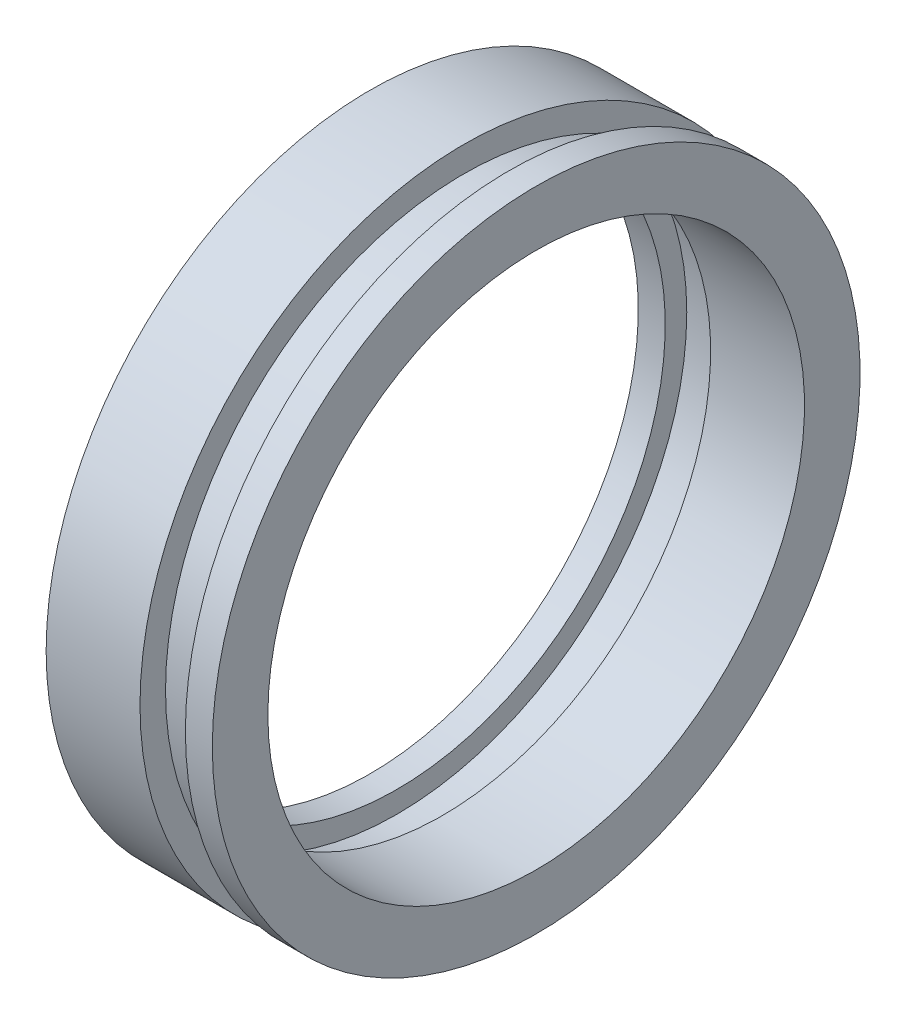
ISO-10303-21;
HEADER;
FILE_DESCRIPTION(('STEP AP214'),'2;1');
FILE_NAME('part.step','',(''),(''),'','','');
FILE_SCHEMA(('AUTOMOTIVE_DESIGN { 1 0 10303 214 1 1 1 1 }'));
ENDSEC;
DATA;
#1=APPLICATION_CONTEXT('core data for automotive mechanical design processes');
#2=APPLICATION_PROTOCOL_DEFINITION('international standard','automotive_design',2000,#1);
#3=PRODUCT_CONTEXT('',#1,'mechanical');
#4=PRODUCT('Part','Part','',(#3));
#5=PRODUCT_RELATED_PRODUCT_CATEGORY('part','',(#4));
#6=PRODUCT_DEFINITION_FORMATION('','',#4);
#7=PRODUCT_DEFINITION_CONTEXT('part definition',#1,'design');
#8=PRODUCT_DEFINITION('design','',#6,#7);
#9=PRODUCT_DEFINITION_SHAPE('','',#8);
#10=(LENGTH_UNIT() NAMED_UNIT(*) SI_UNIT(.MILLI.,.METRE.));
#11=(NAMED_UNIT(*) PLANE_ANGLE_UNIT() SI_UNIT($,.RADIAN.));
#12=(NAMED_UNIT(*) SI_UNIT($,.STERADIAN.) SOLID_ANGLE_UNIT());
#13=UNCERTAINTY_MEASURE_WITH_UNIT(LENGTH_MEASURE(1.E-05),#10,'distance_accuracy_value','');
#14=(GEOMETRIC_REPRESENTATION_CONTEXT(3) GLOBAL_UNCERTAINTY_ASSIGNED_CONTEXT((#13)) GLOBAL_UNIT_ASSIGNED_CONTEXT((#10,
#11,#12)) REPRESENTATION_CONTEXT('',''));
#15=CARTESIAN_POINT('',(0.,0.,0.));
#16=DIRECTION('',(0.,0.,1.));
#17=DIRECTION('',(1.,0.,0.));
#18=AXIS2_PLACEMENT_3D('',#15,#16,#17);
#19=CARTESIAN_POINT('',(0.,0.,0.));
#20=DIRECTION('',(-1.,0.,0.));
#21=DIRECTION('',(0.,0.,1.));
#22=AXIS2_PLACEMENT_3D('',#19,#20,#21);
#23=CYLINDRICAL_SURFACE('',#22,28.829);
#24=CARTESIAN_POINT('',(2.8956,0.,0.));
#25=DIRECTION('',(-1.,0.,0.));
#26=DIRECTION('',(0.,0.,1.));
#27=AXIS2_PLACEMENT_3D('',#24,#25,#26);
#28=CIRCLE('',#27,28.829);
#29=CARTESIAN_POINT('',(2.8956,0.,28.829));
#30=VERTEX_POINT('',#29);
#31=EDGE_CURVE('E79',#30,#30,#28,.T.);
#32=ORIENTED_EDGE('',*,*,#31,.F.);
#33=EDGE_LOOP('',(#32));
#34=FACE_BOUND('',#33,.T.);
#35=CARTESIAN_POINT('',(0.,0.,0.));
#36=DIRECTION('',(-1.,0.,0.));
#37=DIRECTION('',(0.,0.,1.));
#38=AXIS2_PLACEMENT_3D('',#35,#36,#37);
#39=CIRCLE('',#38,28.829);
#40=CARTESIAN_POINT('',(0.,0.,28.829));
#41=VERTEX_POINT('',#40);
#42=EDGE_CURVE('E10',#41,#41,#39,.T.);
#43=ORIENTED_EDGE('',*,*,#42,.T.);
#44=EDGE_LOOP('',(#43));
#45=FACE_BOUND('',#44,.T.);
#46=ADVANCED_FACE('F39',(#34,#45),#23,.F.);
#47=CARTESIAN_POINT('',(0.,28.829,0.));
#48=DIRECTION('',(1.,0.,0.));
#49=DIRECTION('',(0.,0.,-1.));
#50=AXIS2_PLACEMENT_3D('',#47,#48,#49);
#51=PLANE('',#50);
#52=ORIENTED_EDGE('',*,*,#42,.F.);
#53=EDGE_LOOP('',(#52));
#54=FACE_BOUND('',#53,.T.);
#55=CARTESIAN_POINT('',(0.,0.,0.));
#56=DIRECTION('',(-1.,0.,0.));
#57=DIRECTION('',(0.,0.,1.));
#58=AXIS2_PLACEMENT_3D('',#55,#56,#57);
#59=CIRCLE('',#58,34.798);
#60=CARTESIAN_POINT('',(0.,0.,34.798));
#61=VERTEX_POINT('',#60);
#62=EDGE_CURVE('E45',#61,#61,#59,.T.);
#63=ORIENTED_EDGE('',*,*,#62,.T.);
#64=EDGE_LOOP('',(#63));
#65=FACE_BOUND('',#64,.T.);
#66=ADVANCED_FACE('F86',(#54,#65),#51,.F.);
#67=CARTESIAN_POINT('',(0.,0.,0.));
#68=DIRECTION('',(-1.,0.,0.));
#69=DIRECTION('',(0.,0.,1.));
#70=AXIS2_PLACEMENT_3D('',#67,#68,#69);
#71=CYLINDRICAL_SURFACE('',#70,34.798);
#72=ORIENTED_EDGE('',*,*,#62,.F.);
#73=EDGE_LOOP('',(#72));
#74=FACE_BOUND('',#73,.T.);
#75=CARTESIAN_POINT('',(10.0838,0.,0.));
#76=DIRECTION('',(-1.,0.,0.));
#77=DIRECTION('',(0.,0.,1.));
#78=AXIS2_PLACEMENT_3D('',#75,#76,#77);
#79=CIRCLE('',#78,34.798);
#80=CARTESIAN_POINT('',(10.0838,0.,34.798));
#81=VERTEX_POINT('',#80);
#82=EDGE_CURVE('E49',#81,#81,#79,.T.);
#83=ORIENTED_EDGE('',*,*,#82,.T.);
#84=EDGE_LOOP('',(#83));
#85=FACE_BOUND('',#84,.T.);
#86=ADVANCED_FACE('F90',(#74,#85),#71,.T.);
#87=CARTESIAN_POINT('',(10.0838,34.798,0.));
#88=DIRECTION('',(-1.,0.,0.));
#89=DIRECTION('',(0.,0.,1.));
#90=AXIS2_PLACEMENT_3D('',#87,#88,#89);
#91=PLANE('',#90);
#92=ORIENTED_EDGE('',*,*,#82,.F.);
#93=EDGE_LOOP('',(#92));
#94=FACE_BOUND('',#93,.T.);
#95=CARTESIAN_POINT('',(10.0838,0.,0.));
#96=DIRECTION('',(-1.,0.,0.));
#97=DIRECTION('',(0.,0.,1.));
#98=AXIS2_PLACEMENT_3D('',#95,#96,#97);
#99=CIRCLE('',#98,32.0548);
#100=CARTESIAN_POINT('',(10.0838,0.,32.0548));
#101=VERTEX_POINT('',#100);
#102=EDGE_CURVE('E53',#101,#101,#99,.T.);
#103=ORIENTED_EDGE('',*,*,#102,.T.);
#104=EDGE_LOOP('',(#103));
#105=FACE_BOUND('',#104,.T.);
#106=ADVANCED_FACE('F95',(#94,#105),#91,.F.);
#107=CARTESIAN_POINT('',(0.,0.,0.));
#108=DIRECTION('',(-1.,0.,0.));
#109=DIRECTION('',(0.,0.,1.));
#110=AXIS2_PLACEMENT_3D('',#107,#108,#109);
#111=CYLINDRICAL_SURFACE('',#110,32.0548);
#112=ORIENTED_EDGE('',*,*,#102,.F.);
#113=EDGE_LOOP('',(#112));
#114=FACE_BOUND('',#113,.T.);
#115=CARTESIAN_POINT('',(14.9606,0.,0.));
#116=DIRECTION('',(-1.,0.,0.));
#117=DIRECTION('',(0.,0.,1.));
#118=AXIS2_PLACEMENT_3D('',#115,#116,#117);
#119=CIRCLE('',#118,32.0548);
#120=CARTESIAN_POINT('',(14.9606,0.,32.0548));
#121=VERTEX_POINT('',#120);
#122=EDGE_CURVE('E58',#121,#121,#119,.T.);
#123=ORIENTED_EDGE('',*,*,#122,.T.);
#124=EDGE_LOOP('',(#123));
#125=FACE_BOUND('',#124,.T.);
#126=ADVANCED_FACE('F101',(#114,#125),#111,.T.);
#127=CARTESIAN_POINT('',(14.9606,32.0548,0.));
#128=DIRECTION('',(1.,0.,0.));
#129=DIRECTION('',(0.,0.,-1.));
#130=AXIS2_PLACEMENT_3D('',#127,#128,#129);
#131=PLANE('',#130);
#132=ORIENTED_EDGE('',*,*,#122,.F.);
#133=EDGE_LOOP('',(#132));
#134=FACE_BOUND('',#133,.T.);
#135=CARTESIAN_POINT('',(14.9606,0.,0.));
#136=DIRECTION('',(-1.,0.,0.));
#137=DIRECTION('',(0.,0.,1.));
#138=AXIS2_PLACEMENT_3D('',#135,#136,#137);
#139=CIRCLE('',#138,34.798);
#140=CARTESIAN_POINT('',(14.9606,0.,34.798));
#141=VERTEX_POINT('',#140);
#142=EDGE_CURVE('E61',#141,#141,#139,.T.);
#143=ORIENTED_EDGE('',*,*,#142,.T.);
#144=EDGE_LOOP('',(#143));
#145=FACE_BOUND('',#144,.T.);
#146=ADVANCED_FACE('F105',(#134,#145),#131,.F.);
#147=CARTESIAN_POINT('',(0.,0.,0.));
#148=DIRECTION('',(-1.,0.,0.));
#149=DIRECTION('',(0.,0.,1.));
#150=AXIS2_PLACEMENT_3D('',#147,#148,#149);
#151=CYLINDRICAL_SURFACE('',#150,34.798);
#152=ORIENTED_EDGE('',*,*,#142,.F.);
#153=EDGE_LOOP('',(#152));
#154=FACE_BOUND('',#153,.T.);
#155=CARTESIAN_POINT('',(17.8562,0.,0.));
#156=DIRECTION('',(-1.,0.,0.));
#157=DIRECTION('',(0.,0.,1.));
#158=AXIS2_PLACEMENT_3D('',#155,#156,#157);
#159=CIRCLE('',#158,34.798);
#160=CARTESIAN_POINT('',(17.8562,0.,34.798));
#161=VERTEX_POINT('',#160);
#162=EDGE_CURVE('E64',#161,#161,#159,.T.);
#163=ORIENTED_EDGE('',*,*,#162,.T.);
#164=EDGE_LOOP('',(#163));
#165=FACE_BOUND('',#164,.T.);
#166=ADVANCED_FACE('F109',(#154,#165),#151,.T.);
#167=CARTESIAN_POINT('',(17.8562,34.798,0.));
#168=DIRECTION('',(-1.,0.,0.));
#169=DIRECTION('',(0.,0.,1.));
#170=AXIS2_PLACEMENT_3D('',#167,#168,#169);
#171=PLANE('',#170);
#172=ORIENTED_EDGE('',*,*,#162,.F.);
#173=EDGE_LOOP('',(#172));
#174=FACE_BOUND('',#173,.T.);
#175=CARTESIAN_POINT('',(17.8562,0.,0.));
#176=DIRECTION('',(-1.,0.,0.));
#177=DIRECTION('',(0.,0.,1.));
#178=AXIS2_PLACEMENT_3D('',#175,#176,#177);
#179=CIRCLE('',#178,28.829);
#180=CARTESIAN_POINT('',(17.8562,0.,28.829));
#181=VERTEX_POINT('',#180);
#182=EDGE_CURVE('E67',#181,#181,#179,.T.);
#183=ORIENTED_EDGE('',*,*,#182,.T.);
#184=EDGE_LOOP('',(#183));
#185=FACE_BOUND('',#184,.T.);
#186=ADVANCED_FACE('F113',(#174,#185),#171,.F.);
#187=CARTESIAN_POINT('',(0.,0.,0.));
#188=DIRECTION('',(-1.,0.,0.));
#189=DIRECTION('',(0.,0.,1.));
#190=AXIS2_PLACEMENT_3D('',#187,#188,#189);
#191=CYLINDRICAL_SURFACE('',#190,28.829);
#192=ORIENTED_EDGE('',*,*,#182,.F.);
#193=EDGE_LOOP('',(#192));
#194=FACE_BOUND('',#193,.T.);
#195=CARTESIAN_POINT('',(7.7724,0.,0.));
#196=DIRECTION('',(-1.,0.,0.));
#197=DIRECTION('',(0.,0.,1.));
#198=AXIS2_PLACEMENT_3D('',#195,#196,#197);
#199=CIRCLE('',#198,28.829);
#200=CARTESIAN_POINT('',(7.7724,0.,28.829));
#201=VERTEX_POINT('',#200);
#202=EDGE_CURVE('E70',#201,#201,#199,.T.);
#203=ORIENTED_EDGE('',*,*,#202,.T.);
#204=EDGE_LOOP('',(#203));
#205=FACE_BOUND('',#204,.T.);
#206=ADVANCED_FACE('F117',(#194,#205),#191,.F.);
#207=CARTESIAN_POINT('',(7.7724,28.829,0.));
#208=DIRECTION('',(1.,0.,0.));
#209=DIRECTION('',(0.,0.,-1.));
#210=AXIS2_PLACEMENT_3D('',#207,#208,#209);
#211=PLANE('',#210);
#212=ORIENTED_EDGE('',*,*,#202,.F.);
#213=EDGE_LOOP('',(#212));
#214=FACE_BOUND('',#213,.T.);
#215=CARTESIAN_POINT('',(7.7724,0.,0.));
#216=DIRECTION('',(-1.,0.,0.));
#217=DIRECTION('',(0.,0.,1.));
#218=AXIS2_PLACEMENT_3D('',#215,#216,#217);
#219=CIRCLE('',#218,31.1404);
#220=CARTESIAN_POINT('',(7.7724,0.,31.1404));
#221=VERTEX_POINT('',#220);
#222=EDGE_CURVE('E73',#221,#221,#219,.T.);
#223=ORIENTED_EDGE('',*,*,#222,.T.);
#224=EDGE_LOOP('',(#223));
#225=FACE_BOUND('',#224,.T.);
#226=ADVANCED_FACE('F121',(#214,#225),#211,.F.);
#227=CARTESIAN_POINT('',(0.,0.,0.));
#228=DIRECTION('',(-1.,0.,0.));
#229=DIRECTION('',(0.,0.,1.));
#230=AXIS2_PLACEMENT_3D('',#227,#228,#229);
#231=CYLINDRICAL_SURFACE('',#230,31.1404);
#232=ORIENTED_EDGE('',*,*,#222,.F.);
#233=EDGE_LOOP('',(#232));
#234=FACE_BOUND('',#233,.T.);
#235=CARTESIAN_POINT('',(2.8956,0.,0.));
#236=DIRECTION('',(-1.,0.,0.));
#237=DIRECTION('',(0.,0.,1.));
#238=AXIS2_PLACEMENT_3D('',#235,#236,#237);
#239=CIRCLE('',#238,31.1404);
#240=CARTESIAN_POINT('',(2.8956,0.,31.1404));
#241=VERTEX_POINT('',#240);
#242=EDGE_CURVE('E76',#241,#241,#239,.T.);
#243=ORIENTED_EDGE('',*,*,#242,.T.);
#244=EDGE_LOOP('',(#243));
#245=FACE_BOUND('',#244,.T.);
#246=ADVANCED_FACE('F125',(#234,#245),#231,.F.);
#247=CARTESIAN_POINT('',(2.8956,31.1404,0.));
#248=DIRECTION('',(-1.,0.,0.));
#249=DIRECTION('',(0.,0.,1.));
#250=AXIS2_PLACEMENT_3D('',#247,#248,#249);
#251=PLANE('',#250);
#252=ORIENTED_EDGE('',*,*,#242,.F.);
#253=EDGE_LOOP('',(#252));
#254=FACE_BOUND('',#253,.T.);
#255=ORIENTED_EDGE('',*,*,#31,.T.);
#256=EDGE_LOOP('',(#255));
#257=FACE_BOUND('',#256,.T.);
#258=ADVANCED_FACE('F83',(#254,#257),#251,.F.);
#259=CLOSED_SHELL('',(#46,#66,#86,#106,#126,#146,#166,#186,#206,#226,#246,#258));
#260=MANIFOLD_SOLID_BREP('B2',#259);
#261=ADVANCED_BREP_SHAPE_REPRESENTATION('',(#18,#260),#14);
#262=SHAPE_DEFINITION_REPRESENTATION(#9,#261);
ENDSEC;
END-ISO-10303-21;
